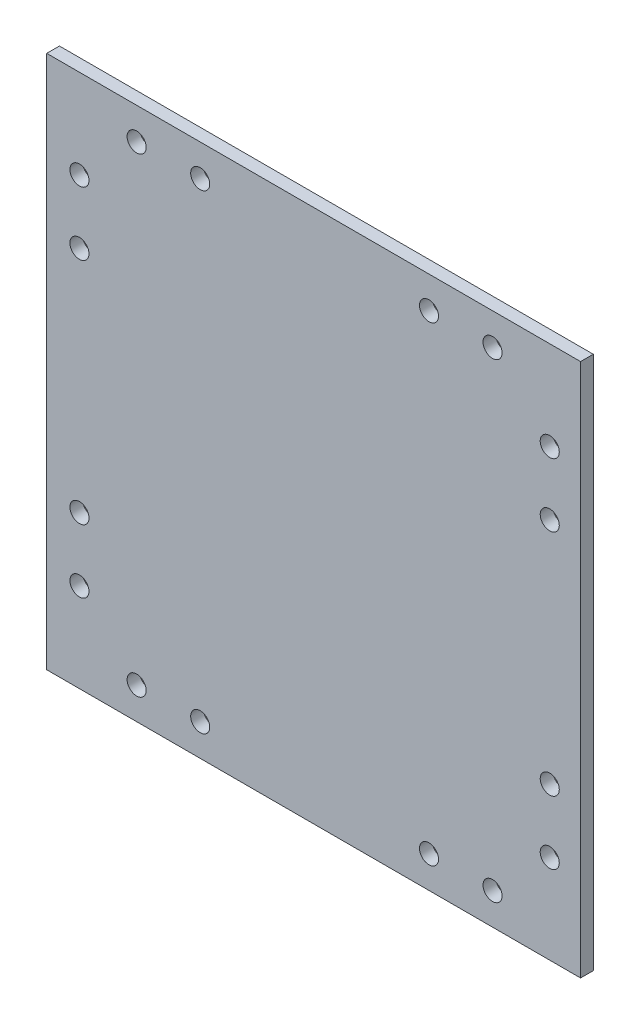
ISO-10303-21;
HEADER;
FILE_DESCRIPTION(('STEP AP214'),'2;1');
FILE_NAME('part.step','',(''),(''),'','','');
FILE_SCHEMA(('AUTOMOTIVE_DESIGN { 1 0 10303 214 1 1 1 1 }'));
ENDSEC;
DATA;
#1=APPLICATION_CONTEXT('core data for automotive mechanical design processes');
#2=APPLICATION_PROTOCOL_DEFINITION('international standard','automotive_design',2000,#1);
#3=PRODUCT_CONTEXT('',#1,'mechanical');
#4=PRODUCT('Part','Part','',(#3));
#5=PRODUCT_RELATED_PRODUCT_CATEGORY('part','',(#4));
#6=PRODUCT_DEFINITION_FORMATION('','',#4);
#7=PRODUCT_DEFINITION_CONTEXT('part definition',#1,'design');
#8=PRODUCT_DEFINITION('design','',#6,#7);
#9=PRODUCT_DEFINITION_SHAPE('','',#8);
#10=(LENGTH_UNIT() NAMED_UNIT(*) SI_UNIT(.MILLI.,.METRE.));
#11=(NAMED_UNIT(*) PLANE_ANGLE_UNIT() SI_UNIT($,.RADIAN.));
#12=(NAMED_UNIT(*) SI_UNIT($,.STERADIAN.) SOLID_ANGLE_UNIT());
#13=UNCERTAINTY_MEASURE_WITH_UNIT(LENGTH_MEASURE(1.E-05),#10,'distance_accuracy_value','');
#14=(GEOMETRIC_REPRESENTATION_CONTEXT(3) GLOBAL_UNCERTAINTY_ASSIGNED_CONTEXT((#13)) GLOBAL_UNIT_ASSIGNED_CONTEXT((#10,
#11,#12)) REPRESENTATION_CONTEXT('',''));
#15=CARTESIAN_POINT('',(0.,0.,0.));
#16=DIRECTION('',(0.,0.,1.));
#17=DIRECTION('',(1.,0.,0.));
#18=AXIS2_PLACEMENT_3D('',#15,#16,#17);
#19=CARTESIAN_POINT('',(42.,42.,2.));
#20=DIRECTION('',(-1.,0.,0.));
#21=DIRECTION('',(0.,-1.,0.));
#22=AXIS2_PLACEMENT_3D('',#19,#20,#21);
#23=PLANE('',#22);
#24=DIRECTION('',(0.,1.,0.));
#25=VECTOR('',#24,1.);
#26=CARTESIAN_POINT('',(42.,42.,0.));
#27=LINE('',#26,#25);
#28=CARTESIAN_POINT('',(42.,-42.,0.));
#29=VERTEX_POINT('',#28);
#30=CARTESIAN_POINT('',(42.,42.,0.));
#31=VERTEX_POINT('',#30);
#32=EDGE_CURVE('E102',#29,#31,#27,.T.);
#33=ORIENTED_EDGE('',*,*,#32,.T.);
#34=DIRECTION('',(0.,0.,-1.));
#35=VECTOR('',#34,1.);
#36=CARTESIAN_POINT('',(42.,42.,2.));
#37=LINE('',#36,#35);
#38=CARTESIAN_POINT('',(42.,42.,2.));
#39=VERTEX_POINT('',#38);
#40=EDGE_CURVE('E11',#39,#31,#37,.T.);
#41=ORIENTED_EDGE('',*,*,#40,.F.);
#42=DIRECTION('',(0.,1.,0.));
#43=VECTOR('',#42,1.);
#44=CARTESIAN_POINT('',(42.,42.,2.));
#45=LINE('',#44,#43);
#46=CARTESIAN_POINT('',(42.,-42.,2.));
#47=VERTEX_POINT('',#46);
#48=EDGE_CURVE('E90',#47,#39,#45,.T.);
#49=ORIENTED_EDGE('',*,*,#48,.F.);
#50=DIRECTION('',(0.,0.,-1.));
#51=VECTOR('',#50,1.);
#52=CARTESIAN_POINT('',(42.,-42.,2.));
#53=LINE('',#52,#51);
#54=EDGE_CURVE('E98',#47,#29,#53,.T.);
#55=ORIENTED_EDGE('',*,*,#54,.T.);
#56=EDGE_LOOP('',(#33,#41,#49,#55));
#57=FACE_BOUND('',#56,.T.);
#58=ADVANCED_FACE('F39',(#57),#23,.F.);
#59=CARTESIAN_POINT('',(-42.,42.,2.));
#60=DIRECTION('',(0.,-1.,0.));
#61=DIRECTION('',(0.,0.,-1.));
#62=AXIS2_PLACEMENT_3D('',#59,#60,#61);
#63=PLANE('',#62);
#64=DIRECTION('',(-1.,0.,0.));
#65=VECTOR('',#64,1.);
#66=CARTESIAN_POINT('',(-42.,42.,0.));
#67=LINE('',#66,#65);
#68=CARTESIAN_POINT('',(-42.,42.,0.));
#69=VERTEX_POINT('',#68);
#70=EDGE_CURVE('E94',#31,#69,#67,.T.);
#71=ORIENTED_EDGE('',*,*,#70,.T.);
#72=DIRECTION('',(0.,0.,-1.));
#73=VECTOR('',#72,1.);
#74=CARTESIAN_POINT('',(-42.,42.,2.));
#75=LINE('',#74,#73);
#76=CARTESIAN_POINT('',(-42.,42.,2.));
#77=VERTEX_POINT('',#76);
#78=EDGE_CURVE('E47',#77,#69,#75,.T.);
#79=ORIENTED_EDGE('',*,*,#78,.F.);
#80=DIRECTION('',(-1.,0.,0.));
#81=VECTOR('',#80,1.);
#82=CARTESIAN_POINT('',(-42.,42.,2.));
#83=LINE('',#82,#81);
#84=EDGE_CURVE('E85',#39,#77,#83,.T.);
#85=ORIENTED_EDGE('',*,*,#84,.F.);
#86=ORIENTED_EDGE('',*,*,#40,.T.);
#87=EDGE_LOOP('',(#71,#79,#85,#86));
#88=FACE_BOUND('',#87,.T.);
#89=ADVANCED_FACE('F93',(#88),#63,.F.);
#90=CARTESIAN_POINT('',(-42.,42.,2.));
#91=DIRECTION('',(1.,0.,0.));
#92=DIRECTION('',(0.,1.,0.));
#93=AXIS2_PLACEMENT_3D('',#90,#91,#92);
#94=PLANE('',#93);
#95=DIRECTION('',(0.,-1.,0.));
#96=VECTOR('',#95,1.);
#97=CARTESIAN_POINT('',(-42.,42.,0.));
#98=LINE('',#97,#96);
#99=CARTESIAN_POINT('',(-42.,-42.,0.));
#100=VERTEX_POINT('',#99);
#101=EDGE_CURVE('E72',#69,#100,#98,.T.);
#102=ORIENTED_EDGE('',*,*,#101,.T.);
#103=DIRECTION('',(0.,0.,-1.));
#104=VECTOR('',#103,1.);
#105=CARTESIAN_POINT('',(-42.,-42.,2.));
#106=LINE('',#105,#104);
#107=CARTESIAN_POINT('',(-42.,-42.,2.));
#108=VERTEX_POINT('',#107);
#109=EDGE_CURVE('E95',#108,#100,#106,.T.);
#110=ORIENTED_EDGE('',*,*,#109,.F.);
#111=DIRECTION('',(0.,-1.,0.));
#112=VECTOR('',#111,1.);
#113=CARTESIAN_POINT('',(-42.,42.,2.));
#114=LINE('',#113,#112);
#115=EDGE_CURVE('E88',#77,#108,#114,.T.);
#116=ORIENTED_EDGE('',*,*,#115,.F.);
#117=ORIENTED_EDGE('',*,*,#78,.T.);
#118=EDGE_LOOP('',(#102,#110,#116,#117));
#119=FACE_BOUND('',#118,.T.);
#120=ADVANCED_FACE('F96',(#119),#94,.F.);
#121=CARTESIAN_POINT('',(-42.,-42.,2.));
#122=DIRECTION('',(0.,1.,0.));
#123=DIRECTION('',(0.,0.,1.));
#124=AXIS2_PLACEMENT_3D('',#121,#122,#123);
#125=PLANE('',#124);
#126=DIRECTION('',(1.,0.,0.));
#127=VECTOR('',#126,1.);
#128=CARTESIAN_POINT('',(-42.,-42.,0.));
#129=LINE('',#128,#127);
#130=EDGE_CURVE('E78',#100,#29,#129,.T.);
#131=ORIENTED_EDGE('',*,*,#130,.T.);
#132=ORIENTED_EDGE('',*,*,#54,.F.);
#133=DIRECTION('',(1.,0.,0.));
#134=VECTOR('',#133,1.);
#135=CARTESIAN_POINT('',(-42.,-42.,2.));
#136=LINE('',#135,#134);
#137=EDGE_CURVE('E55',#108,#47,#136,.T.);
#138=ORIENTED_EDGE('',*,*,#137,.F.);
#139=ORIENTED_EDGE('',*,*,#109,.T.);
#140=EDGE_LOOP('',(#131,#132,#138,#139));
#141=FACE_BOUND('',#140,.T.);
#142=ADVANCED_FACE('F110',(#141),#125,.F.);
#143=CARTESIAN_POINT('',(0.,0.,2.));
#144=DIRECTION('',(0.,0.,1.));
#145=DIRECTION('',(1.,0.,0.));
#146=AXIS2_PLACEMENT_3D('',#143,#144,#145);
#147=PLANE('',#146);
#148=CARTESIAN_POINT('',(-36.8500000000007,-27.9999999999992,2.));
#149=DIRECTION('',(0.,0.,1.));
#150=DIRECTION('',(1.,0.,0.));
#151=AXIS2_PLACEMENT_3D('',#148,#149,#150);
#152=CIRCLE('',#151,1.5);
#153=CARTESIAN_POINT('',(-35.3500000000007,-27.9999999999992,2.));
#154=VERTEX_POINT('',#153);
#155=EDGE_CURVE('E149',#154,#154,#152,.T.);
#156=ORIENTED_EDGE('',*,*,#155,.F.);
#157=EDGE_LOOP('',(#156));
#158=FACE_BOUND('',#157,.T.);
#159=CARTESIAN_POINT('',(-27.8500000000008,-36.9999999999989,2.));
#160=DIRECTION('',(0.,0.,1.));
#161=DIRECTION('',(1.,0.,0.));
#162=AXIS2_PLACEMENT_3D('',#159,#160,#161);
#163=CIRCLE('',#162,1.5);
#164=CARTESIAN_POINT('',(-26.3500000000008,-36.9999999999989,2.));
#165=VERTEX_POINT('',#164);
#166=EDGE_CURVE('E156',#165,#165,#163,.T.);
#167=ORIENTED_EDGE('',*,*,#166,.F.);
#168=EDGE_LOOP('',(#167));
#169=FACE_BOUND('',#168,.T.);
#170=CARTESIAN_POINT('',(-17.8500000000008,-36.999999999999,2.));
#171=DIRECTION('',(0.,0.,1.));
#172=DIRECTION('',(1.,0.,0.));
#173=AXIS2_PLACEMENT_3D('',#170,#171,#172);
#174=CIRCLE('',#173,1.5);
#175=CARTESIAN_POINT('',(-16.3500000000008,-36.999999999999,2.));
#176=VERTEX_POINT('',#175);
#177=EDGE_CURVE('E162',#176,#176,#174,.T.);
#178=ORIENTED_EDGE('',*,*,#177,.F.);
#179=EDGE_LOOP('',(#178));
#180=FACE_BOUND('',#179,.T.);
#181=CARTESIAN_POINT('',(37.1499999999998,28.0000000000011,2.));
#182=DIRECTION('',(0.,0.,1.));
#183=DIRECTION('',(1.,0.,0.));
#184=AXIS2_PLACEMENT_3D('',#181,#182,#183);
#185=CIRCLE('',#184,1.5);
#186=CARTESIAN_POINT('',(38.6499999999998,28.0000000000011,2.));
#187=VERTEX_POINT('',#186);
#188=EDGE_CURVE('E126',#187,#187,#185,.T.);
#189=ORIENTED_EDGE('',*,*,#188,.F.);
#190=EDGE_LOOP('',(#189));
#191=FACE_BOUND('',#190,.T.);
#192=CARTESIAN_POINT('',(37.1499999999998,18.0000000000011,2.));
#193=DIRECTION('',(0.,0.,1.));
#194=DIRECTION('',(1.,0.,0.));
#195=AXIS2_PLACEMENT_3D('',#192,#193,#194);
#196=CIRCLE('',#195,1.5);
#197=CARTESIAN_POINT('',(38.6499999999998,18.0000000000011,2.));
#198=VERTEX_POINT('',#197);
#199=EDGE_CURVE('E125',#198,#198,#196,.T.);
#200=ORIENTED_EDGE('',*,*,#199,.F.);
#201=EDGE_LOOP('',(#200));
#202=FACE_BOUND('',#201,.T.);
#203=CARTESIAN_POINT('',(37.1499999999997,-17.9999999999993,2.));
#204=DIRECTION('',(0.,0.,1.));
#205=DIRECTION('',(1.,0.,0.));
#206=AXIS2_PLACEMENT_3D('',#203,#204,#205);
#207=CIRCLE('',#206,1.5);
#208=CARTESIAN_POINT('',(38.6499999999997,-17.9999999999993,2.));
#209=VERTEX_POINT('',#208);
#210=EDGE_CURVE('E132',#209,#209,#207,.T.);
#211=ORIENTED_EDGE('',*,*,#210,.F.);
#212=EDGE_LOOP('',(#211));
#213=FACE_BOUND('',#212,.T.);
#214=CARTESIAN_POINT('',(37.1499999999997,-27.9999999999993,2.));
#215=DIRECTION('',(0.,0.,1.));
#216=DIRECTION('',(1.,0.,0.));
#217=AXIS2_PLACEMENT_3D('',#214,#215,#216);
#218=CIRCLE('',#217,1.5);
#219=CARTESIAN_POINT('',(38.6499999999997,-27.9999999999993,2.));
#220=VERTEX_POINT('',#219);
#221=EDGE_CURVE('E138',#220,#220,#218,.T.);
#222=ORIENTED_EDGE('',*,*,#221,.F.);
#223=EDGE_LOOP('',(#222));
#224=FACE_BOUND('',#223,.T.);
#225=CARTESIAN_POINT('',(28.1499999999998,-36.9999999999996,2.));
#226=DIRECTION('',(0.,0.,1.));
#227=DIRECTION('',(1.,0.,0.));
#228=AXIS2_PLACEMENT_3D('',#225,#226,#227);
#229=CIRCLE('',#228,1.5);
#230=CARTESIAN_POINT('',(29.6499999999998,-36.9999999999996,2.));
#231=VERTEX_POINT('',#230);
#232=EDGE_CURVE('E119',#231,#231,#229,.T.);
#233=ORIENTED_EDGE('',*,*,#232,.F.);
#234=EDGE_LOOP('',(#233));
#235=FACE_BOUND('',#234,.T.);
#236=CARTESIAN_POINT('',(-27.8500000000005,37.0000000000011,2.));
#237=DIRECTION('',(0.,0.,1.));
#238=DIRECTION('',(1.,0.,0.));
#239=AXIS2_PLACEMENT_3D('',#236,#237,#238);
#240=CIRCLE('',#239,1.5);
#241=CARTESIAN_POINT('',(-26.3500000000005,37.0000000000011,2.));
#242=VERTEX_POINT('',#241);
#243=EDGE_CURVE('E197',#242,#242,#240,.T.);
#244=ORIENTED_EDGE('',*,*,#243,.F.);
#245=EDGE_LOOP('',(#244));
#246=FACE_BOUND('',#245,.T.);
#247=CARTESIAN_POINT('',(-17.8500000000005,37.000000000001,2.));
#248=DIRECTION('',(0.,0.,1.));
#249=DIRECTION('',(1.,0.,0.));
#250=AXIS2_PLACEMENT_3D('',#247,#248,#249);
#251=CIRCLE('',#250,1.5);
#252=CARTESIAN_POINT('',(-16.3500000000005,37.000000000001,2.));
#253=VERTEX_POINT('',#252);
#254=EDGE_CURVE('E203',#253,#253,#251,.T.);
#255=ORIENTED_EDGE('',*,*,#254,.F.);
#256=EDGE_LOOP('',(#255));
#257=FACE_BOUND('',#256,.T.);
#258=CARTESIAN_POINT('',(18.1499999999996,37.0000000000005,2.));
#259=DIRECTION('',(0.,0.,1.));
#260=DIRECTION('',(1.,0.,0.));
#261=AXIS2_PLACEMENT_3D('',#258,#259,#260);
#262=CIRCLE('',#261,1.5);
#263=CARTESIAN_POINT('',(19.6499999999996,37.0000000000005,2.));
#264=VERTEX_POINT('',#263);
#265=EDGE_CURVE('E174',#264,#264,#262,.T.);
#266=ORIENTED_EDGE('',*,*,#265,.F.);
#267=EDGE_LOOP('',(#266));
#268=FACE_BOUND('',#267,.T.);
#269=CARTESIAN_POINT('',(28.1499999999996,37.0000000000005,2.));
#270=DIRECTION('',(0.,0.,1.));
#271=DIRECTION('',(1.,0.,0.));
#272=AXIS2_PLACEMENT_3D('',#269,#270,#271);
#273=CIRCLE('',#272,1.5);
#274=CARTESIAN_POINT('',(29.6499999999996,37.0000000000005,2.));
#275=VERTEX_POINT('',#274);
#276=EDGE_CURVE('E173',#275,#275,#273,.T.);
#277=ORIENTED_EDGE('',*,*,#276,.F.);
#278=EDGE_LOOP('',(#277));
#279=FACE_BOUND('',#278,.T.);
#280=CARTESIAN_POINT('',(-36.8500000000008,28.0000000000007,2.));
#281=DIRECTION('',(0.,0.,1.));
#282=DIRECTION('',(1.,0.,0.));
#283=AXIS2_PLACEMENT_3D('',#280,#281,#282);
#284=CIRCLE('',#283,1.5);
#285=CARTESIAN_POINT('',(-35.3500000000008,28.0000000000007,2.));
#286=VERTEX_POINT('',#285);
#287=EDGE_CURVE('E180',#286,#286,#284,.T.);
#288=ORIENTED_EDGE('',*,*,#287,.F.);
#289=EDGE_LOOP('',(#288));
#290=FACE_BOUND('',#289,.T.);
#291=CARTESIAN_POINT('',(-36.8500000000005,18.0000000000007,2.));
#292=DIRECTION('',(0.,0.,1.));
#293=DIRECTION('',(1.,0.,0.));
#294=AXIS2_PLACEMENT_3D('',#291,#292,#293);
#295=CIRCLE('',#294,1.5);
#296=CARTESIAN_POINT('',(-35.3500000000005,18.0000000000007,2.));
#297=VERTEX_POINT('',#296);
#298=EDGE_CURVE('E186',#297,#297,#295,.T.);
#299=ORIENTED_EDGE('',*,*,#298,.F.);
#300=EDGE_LOOP('',(#299));
#301=FACE_BOUND('',#300,.T.);
#302=CARTESIAN_POINT('',(-36.8500000000007,-17.9999999999992,2.));
#303=DIRECTION('',(0.,0.,1.));
#304=DIRECTION('',(1.,0.,0.));
#305=AXIS2_PLACEMENT_3D('',#302,#303,#304);
#306=CIRCLE('',#305,1.5);
#307=CARTESIAN_POINT('',(-35.3500000000007,-17.9999999999992,2.));
#308=VERTEX_POINT('',#307);
#309=EDGE_CURVE('E150',#308,#308,#306,.T.);
#310=ORIENTED_EDGE('',*,*,#309,.F.);
#311=EDGE_LOOP('',(#310));
#312=FACE_BOUND('',#311,.T.);
#313=CARTESIAN_POINT('',(18.1499999999998,-36.9999999999997,2.));
#314=DIRECTION('',(0.,0.,1.));
#315=DIRECTION('',(1.,0.,0.));
#316=AXIS2_PLACEMENT_3D('',#313,#314,#315);
#317=CIRCLE('',#316,1.5);
#318=CARTESIAN_POINT('',(19.6499999999998,-36.9999999999997,2.));
#319=VERTEX_POINT('',#318);
#320=EDGE_CURVE('E116',#319,#319,#317,.T.);
#321=ORIENTED_EDGE('',*,*,#320,.F.);
#322=EDGE_LOOP('',(#321));
#323=FACE_BOUND('',#322,.T.);
#324=ORIENTED_EDGE('',*,*,#48,.T.);
#325=ORIENTED_EDGE('',*,*,#84,.T.);
#326=ORIENTED_EDGE('',*,*,#115,.T.);
#327=ORIENTED_EDGE('',*,*,#137,.T.);
#328=EDGE_LOOP('',(#324,#325,#326,#327));
#329=FACE_BOUND('',#328,.T.);
#330=ADVANCED_FACE('F86',(#158,#169,#180,#191,#202,#213,#224,#235,#246,#257,#268,#279,#290,#301,
#312,#323,#329),#147,.T.);
#331=CARTESIAN_POINT('',(0.,0.,0.));
#332=DIRECTION('',(0.,0.,1.));
#333=DIRECTION('',(1.,0.,0.));
#334=AXIS2_PLACEMENT_3D('',#331,#332,#333);
#335=PLANE('',#334);
#336=CARTESIAN_POINT('',(-36.8500000000007,-27.9999999999992,0.));
#337=DIRECTION('',(0.,0.,1.));
#338=DIRECTION('',(1.,0.,0.));
#339=AXIS2_PLACEMENT_3D('',#336,#337,#338);
#340=CIRCLE('',#339,1.5);
#341=CARTESIAN_POINT('',(-35.3500000000007,-27.9999999999992,0.));
#342=VERTEX_POINT('',#341);
#343=EDGE_CURVE('E146',#342,#342,#340,.T.);
#344=ORIENTED_EDGE('',*,*,#343,.T.);
#345=EDGE_LOOP('',(#344));
#346=FACE_BOUND('',#345,.T.);
#347=CARTESIAN_POINT('',(-27.8500000000008,-36.9999999999989,0.));
#348=DIRECTION('',(0.,0.,1.));
#349=DIRECTION('',(1.,0.,0.));
#350=AXIS2_PLACEMENT_3D('',#347,#348,#349);
#351=CIRCLE('',#350,1.5);
#352=CARTESIAN_POINT('',(-26.3500000000008,-36.9999999999989,0.));
#353=VERTEX_POINT('',#352);
#354=EDGE_CURVE('E153',#353,#353,#351,.T.);
#355=ORIENTED_EDGE('',*,*,#354,.T.);
#356=EDGE_LOOP('',(#355));
#357=FACE_BOUND('',#356,.T.);
#358=CARTESIAN_POINT('',(-17.8500000000008,-36.999999999999,0.));
#359=DIRECTION('',(0.,0.,1.));
#360=DIRECTION('',(1.,0.,0.));
#361=AXIS2_PLACEMENT_3D('',#358,#359,#360);
#362=CIRCLE('',#361,1.5);
#363=CARTESIAN_POINT('',(-16.3500000000008,-36.999999999999,0.));
#364=VERTEX_POINT('',#363);
#365=EDGE_CURVE('E159',#364,#364,#362,.T.);
#366=ORIENTED_EDGE('',*,*,#365,.T.);
#367=EDGE_LOOP('',(#366));
#368=FACE_BOUND('',#367,.T.);
#369=CARTESIAN_POINT('',(37.1499999999998,28.0000000000011,0.));
#370=DIRECTION('',(0.,0.,1.));
#371=DIRECTION('',(1.,0.,0.));
#372=AXIS2_PLACEMENT_3D('',#369,#370,#371);
#373=CIRCLE('',#372,1.5);
#374=CARTESIAN_POINT('',(38.6499999999998,28.0000000000011,0.));
#375=VERTEX_POINT('',#374);
#376=EDGE_CURVE('E165',#375,#375,#373,.T.);
#377=ORIENTED_EDGE('',*,*,#376,.T.);
#378=EDGE_LOOP('',(#377));
#379=FACE_BOUND('',#378,.T.);
#380=CARTESIAN_POINT('',(37.1499999999998,18.0000000000011,0.));
#381=DIRECTION('',(0.,0.,1.));
#382=DIRECTION('',(1.,0.,0.));
#383=AXIS2_PLACEMENT_3D('',#380,#381,#382);
#384=CIRCLE('',#383,1.5);
#385=CARTESIAN_POINT('',(38.6499999999998,18.0000000000011,0.));
#386=VERTEX_POINT('',#385);
#387=EDGE_CURVE('E122',#386,#386,#384,.T.);
#388=ORIENTED_EDGE('',*,*,#387,.T.);
#389=EDGE_LOOP('',(#388));
#390=FACE_BOUND('',#389,.T.);
#391=CARTESIAN_POINT('',(37.1499999999997,-17.9999999999993,0.));
#392=DIRECTION('',(0.,0.,1.));
#393=DIRECTION('',(1.,0.,0.));
#394=AXIS2_PLACEMENT_3D('',#391,#392,#393);
#395=CIRCLE('',#394,1.5);
#396=CARTESIAN_POINT('',(38.6499999999997,-17.9999999999993,0.));
#397=VERTEX_POINT('',#396);
#398=EDGE_CURVE('E129',#397,#397,#395,.T.);
#399=ORIENTED_EDGE('',*,*,#398,.T.);
#400=EDGE_LOOP('',(#399));
#401=FACE_BOUND('',#400,.T.);
#402=CARTESIAN_POINT('',(37.1499999999997,-27.9999999999993,0.));
#403=DIRECTION('',(0.,0.,1.));
#404=DIRECTION('',(1.,0.,0.));
#405=AXIS2_PLACEMENT_3D('',#402,#403,#404);
#406=CIRCLE('',#405,1.5);
#407=CARTESIAN_POINT('',(38.6499999999997,-27.9999999999993,0.));
#408=VERTEX_POINT('',#407);
#409=EDGE_CURVE('E135',#408,#408,#406,.T.);
#410=ORIENTED_EDGE('',*,*,#409,.T.);
#411=EDGE_LOOP('',(#410));
#412=FACE_BOUND('',#411,.T.);
#413=CARTESIAN_POINT('',(28.1499999999998,-36.9999999999996,0.));
#414=DIRECTION('',(0.,0.,1.));
#415=DIRECTION('',(1.,0.,0.));
#416=AXIS2_PLACEMENT_3D('',#413,#414,#415);
#417=CIRCLE('',#416,1.5);
#418=CARTESIAN_POINT('',(29.6499999999998,-36.9999999999996,0.));
#419=VERTEX_POINT('',#418);
#420=EDGE_CURVE('E141',#419,#419,#417,.T.);
#421=ORIENTED_EDGE('',*,*,#420,.T.);
#422=EDGE_LOOP('',(#421));
#423=FACE_BOUND('',#422,.T.);
#424=CARTESIAN_POINT('',(-27.8500000000005,37.0000000000011,0.));
#425=DIRECTION('',(0.,0.,1.));
#426=DIRECTION('',(1.,0.,0.));
#427=AXIS2_PLACEMENT_3D('',#424,#425,#426);
#428=CIRCLE('',#427,1.5);
#429=CARTESIAN_POINT('',(-26.3500000000005,37.0000000000011,0.));
#430=VERTEX_POINT('',#429);
#431=EDGE_CURVE('E194',#430,#430,#428,.T.);
#432=ORIENTED_EDGE('',*,*,#431,.T.);
#433=EDGE_LOOP('',(#432));
#434=FACE_BOUND('',#433,.T.);
#435=CARTESIAN_POINT('',(-17.8500000000005,37.000000000001,0.));
#436=DIRECTION('',(0.,0.,1.));
#437=DIRECTION('',(1.,0.,0.));
#438=AXIS2_PLACEMENT_3D('',#435,#436,#437);
#439=CIRCLE('',#438,1.5);
#440=CARTESIAN_POINT('',(-16.3500000000005,37.000000000001,0.));
#441=VERTEX_POINT('',#440);
#442=EDGE_CURVE('E200',#441,#441,#439,.T.);
#443=ORIENTED_EDGE('',*,*,#442,.T.);
#444=EDGE_LOOP('',(#443));
#445=FACE_BOUND('',#444,.T.);
#446=CARTESIAN_POINT('',(18.1499999999996,37.0000000000005,0.));
#447=DIRECTION('',(0.,0.,1.));
#448=DIRECTION('',(1.,0.,0.));
#449=AXIS2_PLACEMENT_3D('',#446,#447,#448);
#450=CIRCLE('',#449,1.5);
#451=CARTESIAN_POINT('',(19.6499999999996,37.0000000000005,0.));
#452=VERTEX_POINT('',#451);
#453=EDGE_CURVE('E206',#452,#452,#450,.T.);
#454=ORIENTED_EDGE('',*,*,#453,.T.);
#455=EDGE_LOOP('',(#454));
#456=FACE_BOUND('',#455,.T.);
#457=CARTESIAN_POINT('',(28.1499999999996,37.0000000000005,0.));
#458=DIRECTION('',(0.,0.,1.));
#459=DIRECTION('',(1.,0.,0.));
#460=AXIS2_PLACEMENT_3D('',#457,#458,#459);
#461=CIRCLE('',#460,1.5);
#462=CARTESIAN_POINT('',(29.6499999999996,37.0000000000005,0.));
#463=VERTEX_POINT('',#462);
#464=EDGE_CURVE('E170',#463,#463,#461,.T.);
#465=ORIENTED_EDGE('',*,*,#464,.T.);
#466=EDGE_LOOP('',(#465));
#467=FACE_BOUND('',#466,.T.);
#468=CARTESIAN_POINT('',(-36.8500000000008,28.0000000000007,0.));
#469=DIRECTION('',(0.,0.,1.));
#470=DIRECTION('',(1.,0.,0.));
#471=AXIS2_PLACEMENT_3D('',#468,#469,#470);
#472=CIRCLE('',#471,1.5);
#473=CARTESIAN_POINT('',(-35.3500000000008,28.0000000000007,0.));
#474=VERTEX_POINT('',#473);
#475=EDGE_CURVE('E177',#474,#474,#472,.T.);
#476=ORIENTED_EDGE('',*,*,#475,.T.);
#477=EDGE_LOOP('',(#476));
#478=FACE_BOUND('',#477,.T.);
#479=CARTESIAN_POINT('',(-36.8500000000005,18.0000000000007,0.));
#480=DIRECTION('',(0.,0.,1.));
#481=DIRECTION('',(1.,0.,0.));
#482=AXIS2_PLACEMENT_3D('',#479,#480,#481);
#483=CIRCLE('',#482,1.5);
#484=CARTESIAN_POINT('',(-35.3500000000005,18.0000000000007,0.));
#485=VERTEX_POINT('',#484);
#486=EDGE_CURVE('E183',#485,#485,#483,.T.);
#487=ORIENTED_EDGE('',*,*,#486,.T.);
#488=EDGE_LOOP('',(#487));
#489=FACE_BOUND('',#488,.T.);
#490=CARTESIAN_POINT('',(-36.8500000000007,-17.9999999999992,0.));
#491=DIRECTION('',(0.,0.,1.));
#492=DIRECTION('',(1.,0.,0.));
#493=AXIS2_PLACEMENT_3D('',#490,#491,#492);
#494=CIRCLE('',#493,1.5);
#495=CARTESIAN_POINT('',(-35.3500000000007,-17.9999999999992,0.));
#496=VERTEX_POINT('',#495);
#497=EDGE_CURVE('E189',#496,#496,#494,.T.);
#498=ORIENTED_EDGE('',*,*,#497,.T.);
#499=EDGE_LOOP('',(#498));
#500=FACE_BOUND('',#499,.T.);
#501=CARTESIAN_POINT('',(18.1499999999998,-36.9999999999997,0.));
#502=DIRECTION('',(0.,0.,1.));
#503=DIRECTION('',(1.,0.,0.));
#504=AXIS2_PLACEMENT_3D('',#501,#502,#503);
#505=CIRCLE('',#504,1.5);
#506=CARTESIAN_POINT('',(19.6499999999998,-36.9999999999997,0.));
#507=VERTEX_POINT('',#506);
#508=EDGE_CURVE('E105',#507,#507,#505,.T.);
#509=ORIENTED_EDGE('',*,*,#508,.T.);
#510=EDGE_LOOP('',(#509));
#511=FACE_BOUND('',#510,.T.);
#512=ORIENTED_EDGE('',*,*,#32,.F.);
#513=ORIENTED_EDGE('',*,*,#130,.F.);
#514=ORIENTED_EDGE('',*,*,#101,.F.);
#515=ORIENTED_EDGE('',*,*,#70,.F.);
#516=EDGE_LOOP('',(#512,#513,#514,#515));
#517=FACE_BOUND('',#516,.T.);
#518=ADVANCED_FACE('F113',(#346,#357,#368,#379,#390,#401,#412,#423,#434,#445,#456,#467,#478,
#489,#500,#511,#517),#335,.F.);
#519=CARTESIAN_POINT('',(18.1499999999998,-36.9999999999997,0.));
#520=DIRECTION('',(0.,0.,1.));
#521=DIRECTION('',(1.,0.,0.));
#522=AXIS2_PLACEMENT_3D('',#519,#520,#521);
#523=CYLINDRICAL_SURFACE('',#522,1.5);
#524=ORIENTED_EDGE('',*,*,#508,.F.);
#525=EDGE_LOOP('',(#524));
#526=FACE_BOUND('',#525,.T.);
#527=ORIENTED_EDGE('',*,*,#320,.T.);
#528=EDGE_LOOP('',(#527));
#529=FACE_BOUND('',#528,.T.);
#530=ADVANCED_FACE('F228',(#526,#529),#523,.F.);
#531=CARTESIAN_POINT('',(-36.8500000000007,-17.9999999999992,0.));
#532=DIRECTION('',(0.,0.,1.));
#533=DIRECTION('',(1.,0.,0.));
#534=AXIS2_PLACEMENT_3D('',#531,#532,#533);
#535=CYLINDRICAL_SURFACE('',#534,1.5);
#536=ORIENTED_EDGE('',*,*,#497,.F.);
#537=EDGE_LOOP('',(#536));
#538=FACE_BOUND('',#537,.T.);
#539=ORIENTED_EDGE('',*,*,#309,.T.);
#540=EDGE_LOOP('',(#539));
#541=FACE_BOUND('',#540,.T.);
#542=ADVANCED_FACE('F230',(#538,#541),#535,.F.);
#543=CARTESIAN_POINT('',(-36.8500000000005,18.0000000000007,0.));
#544=DIRECTION('',(0.,0.,1.));
#545=DIRECTION('',(1.,0.,0.));
#546=AXIS2_PLACEMENT_3D('',#543,#544,#545);
#547=CYLINDRICAL_SURFACE('',#546,1.5);
#548=ORIENTED_EDGE('',*,*,#486,.F.);
#549=EDGE_LOOP('',(#548));
#550=FACE_BOUND('',#549,.T.);
#551=ORIENTED_EDGE('',*,*,#298,.T.);
#552=EDGE_LOOP('',(#551));
#553=FACE_BOUND('',#552,.T.);
#554=ADVANCED_FACE('F237',(#550,#553),#547,.F.);
#555=CARTESIAN_POINT('',(-36.8500000000008,28.0000000000007,0.));
#556=DIRECTION('',(0.,0.,1.));
#557=DIRECTION('',(1.,0.,0.));
#558=AXIS2_PLACEMENT_3D('',#555,#556,#557);
#559=CYLINDRICAL_SURFACE('',#558,1.5);
#560=ORIENTED_EDGE('',*,*,#475,.F.);
#561=EDGE_LOOP('',(#560));
#562=FACE_BOUND('',#561,.T.);
#563=ORIENTED_EDGE('',*,*,#287,.T.);
#564=EDGE_LOOP('',(#563));
#565=FACE_BOUND('',#564,.T.);
#566=ADVANCED_FACE('F288',(#562,#565),#559,.F.);
#567=CARTESIAN_POINT('',(28.1499999999996,37.0000000000005,0.));
#568=DIRECTION('',(0.,0.,1.));
#569=DIRECTION('',(1.,0.,0.));
#570=AXIS2_PLACEMENT_3D('',#567,#568,#569);
#571=CYLINDRICAL_SURFACE('',#570,1.5);
#572=ORIENTED_EDGE('',*,*,#464,.F.);
#573=EDGE_LOOP('',(#572));
#574=FACE_BOUND('',#573,.T.);
#575=ORIENTED_EDGE('',*,*,#276,.T.);
#576=EDGE_LOOP('',(#575));
#577=FACE_BOUND('',#576,.T.);
#578=ADVANCED_FACE('F299',(#574,#577),#571,.F.);
#579=CARTESIAN_POINT('',(18.1499999999996,37.0000000000005,0.));
#580=DIRECTION('',(0.,0.,1.));
#581=DIRECTION('',(1.,0.,0.));
#582=AXIS2_PLACEMENT_3D('',#579,#580,#581);
#583=CYLINDRICAL_SURFACE('',#582,1.5);
#584=ORIENTED_EDGE('',*,*,#453,.F.);
#585=EDGE_LOOP('',(#584));
#586=FACE_BOUND('',#585,.T.);
#587=ORIENTED_EDGE('',*,*,#265,.T.);
#588=EDGE_LOOP('',(#587));
#589=FACE_BOUND('',#588,.T.);
#590=ADVANCED_FACE('F212',(#586,#589),#583,.F.);
#591=CARTESIAN_POINT('',(-17.8500000000005,37.000000000001,0.));
#592=DIRECTION('',(0.,0.,1.));
#593=DIRECTION('',(1.,0.,0.));
#594=AXIS2_PLACEMENT_3D('',#591,#592,#593);
#595=CYLINDRICAL_SURFACE('',#594,1.5);
#596=ORIENTED_EDGE('',*,*,#442,.F.);
#597=EDGE_LOOP('',(#596));
#598=FACE_BOUND('',#597,.T.);
#599=ORIENTED_EDGE('',*,*,#254,.T.);
#600=EDGE_LOOP('',(#599));
#601=FACE_BOUND('',#600,.T.);
#602=ADVANCED_FACE('F320',(#598,#601),#595,.F.);
#603=CARTESIAN_POINT('',(-27.8500000000005,37.0000000000011,0.));
#604=DIRECTION('',(0.,0.,1.));
#605=DIRECTION('',(1.,0.,0.));
#606=AXIS2_PLACEMENT_3D('',#603,#604,#605);
#607=CYLINDRICAL_SURFACE('',#606,1.5);
#608=ORIENTED_EDGE('',*,*,#431,.F.);
#609=EDGE_LOOP('',(#608));
#610=FACE_BOUND('',#609,.T.);
#611=ORIENTED_EDGE('',*,*,#243,.T.);
#612=EDGE_LOOP('',(#611));
#613=FACE_BOUND('',#612,.T.);
#614=ADVANCED_FACE('F331',(#610,#613),#607,.F.);
#615=CARTESIAN_POINT('',(28.1499999999998,-36.9999999999996,0.));
#616=DIRECTION('',(0.,0.,1.));
#617=DIRECTION('',(1.,0.,0.));
#618=AXIS2_PLACEMENT_3D('',#615,#616,#617);
#619=CYLINDRICAL_SURFACE('',#618,1.5);
#620=ORIENTED_EDGE('',*,*,#420,.F.);
#621=EDGE_LOOP('',(#620));
#622=FACE_BOUND('',#621,.T.);
#623=ORIENTED_EDGE('',*,*,#232,.T.);
#624=EDGE_LOOP('',(#623));
#625=FACE_BOUND('',#624,.T.);
#626=ADVANCED_FACE('F342',(#622,#625),#619,.F.);
#627=CARTESIAN_POINT('',(37.1499999999997,-27.9999999999993,0.));
#628=DIRECTION('',(0.,0.,1.));
#629=DIRECTION('',(1.,0.,0.));
#630=AXIS2_PLACEMENT_3D('',#627,#628,#629);
#631=CYLINDRICAL_SURFACE('',#630,1.5);
#632=ORIENTED_EDGE('',*,*,#409,.F.);
#633=EDGE_LOOP('',(#632));
#634=FACE_BOUND('',#633,.T.);
#635=ORIENTED_EDGE('',*,*,#221,.T.);
#636=EDGE_LOOP('',(#635));
#637=FACE_BOUND('',#636,.T.);
#638=ADVANCED_FACE('F353',(#634,#637),#631,.F.);
#639=CARTESIAN_POINT('',(37.1499999999997,-17.9999999999993,0.));
#640=DIRECTION('',(0.,0.,1.));
#641=DIRECTION('',(1.,0.,0.));
#642=AXIS2_PLACEMENT_3D('',#639,#640,#641);
#643=CYLINDRICAL_SURFACE('',#642,1.5);
#644=ORIENTED_EDGE('',*,*,#398,.F.);
#645=EDGE_LOOP('',(#644));
#646=FACE_BOUND('',#645,.T.);
#647=ORIENTED_EDGE('',*,*,#210,.T.);
#648=EDGE_LOOP('',(#647));
#649=FACE_BOUND('',#648,.T.);
#650=ADVANCED_FACE('F364',(#646,#649),#643,.F.);
#651=CARTESIAN_POINT('',(37.1499999999998,18.0000000000011,0.));
#652=DIRECTION('',(0.,0.,1.));
#653=DIRECTION('',(1.,0.,0.));
#654=AXIS2_PLACEMENT_3D('',#651,#652,#653);
#655=CYLINDRICAL_SURFACE('',#654,1.5);
#656=ORIENTED_EDGE('',*,*,#387,.F.);
#657=EDGE_LOOP('',(#656));
#658=FACE_BOUND('',#657,.T.);
#659=ORIENTED_EDGE('',*,*,#199,.T.);
#660=EDGE_LOOP('',(#659));
#661=FACE_BOUND('',#660,.T.);
#662=ADVANCED_FACE('F375',(#658,#661),#655,.F.);
#663=CARTESIAN_POINT('',(37.1499999999998,28.0000000000011,0.));
#664=DIRECTION('',(0.,0.,1.));
#665=DIRECTION('',(1.,0.,0.));
#666=AXIS2_PLACEMENT_3D('',#663,#664,#665);
#667=CYLINDRICAL_SURFACE('',#666,1.5);
#668=ORIENTED_EDGE('',*,*,#376,.F.);
#669=EDGE_LOOP('',(#668));
#670=FACE_BOUND('',#669,.T.);
#671=ORIENTED_EDGE('',*,*,#188,.T.);
#672=EDGE_LOOP('',(#671));
#673=FACE_BOUND('',#672,.T.);
#674=ADVANCED_FACE('F386',(#670,#673),#667,.F.);
#675=CARTESIAN_POINT('',(-17.8500000000008,-36.999999999999,0.));
#676=DIRECTION('',(0.,0.,1.));
#677=DIRECTION('',(1.,0.,0.));
#678=AXIS2_PLACEMENT_3D('',#675,#676,#677);
#679=CYLINDRICAL_SURFACE('',#678,1.5);
#680=ORIENTED_EDGE('',*,*,#365,.F.);
#681=EDGE_LOOP('',(#680));
#682=FACE_BOUND('',#681,.T.);
#683=ORIENTED_EDGE('',*,*,#177,.T.);
#684=EDGE_LOOP('',(#683));
#685=FACE_BOUND('',#684,.T.);
#686=ADVANCED_FACE('F396',(#682,#685),#679,.F.);
#687=CARTESIAN_POINT('',(-27.8500000000008,-36.9999999999989,0.));
#688=DIRECTION('',(0.,0.,1.));
#689=DIRECTION('',(1.,0.,0.));
#690=AXIS2_PLACEMENT_3D('',#687,#688,#689);
#691=CYLINDRICAL_SURFACE('',#690,1.5);
#692=ORIENTED_EDGE('',*,*,#354,.F.);
#693=EDGE_LOOP('',(#692));
#694=FACE_BOUND('',#693,.T.);
#695=ORIENTED_EDGE('',*,*,#166,.T.);
#696=EDGE_LOOP('',(#695));
#697=FACE_BOUND('',#696,.T.);
#698=ADVANCED_FACE('F407',(#694,#697),#691,.F.);
#699=CARTESIAN_POINT('',(-36.8500000000007,-27.9999999999992,0.));
#700=DIRECTION('',(0.,0.,1.));
#701=DIRECTION('',(1.,0.,0.));
#702=AXIS2_PLACEMENT_3D('',#699,#700,#701);
#703=CYLINDRICAL_SURFACE('',#702,1.5);
#704=ORIENTED_EDGE('',*,*,#343,.F.);
#705=EDGE_LOOP('',(#704));
#706=FACE_BOUND('',#705,.T.);
#707=ORIENTED_EDGE('',*,*,#155,.T.);
#708=EDGE_LOOP('',(#707));
#709=FACE_BOUND('',#708,.T.);
#710=ADVANCED_FACE('F418',(#706,#709),#703,.F.);
#711=CLOSED_SHELL('',(#58,#89,#120,#142,#330,#518,#530,#542,#554,#566,#578,#590,#602,#614,#626,
#638,#650,#662,#674,#686,#698,#710));
#712=MANIFOLD_SOLID_BREP('B2',#711);
#713=ADVANCED_BREP_SHAPE_REPRESENTATION('',(#18,#712),#14);
#714=SHAPE_DEFINITION_REPRESENTATION(#9,#713);
ENDSEC;
END-ISO-10303-21;
